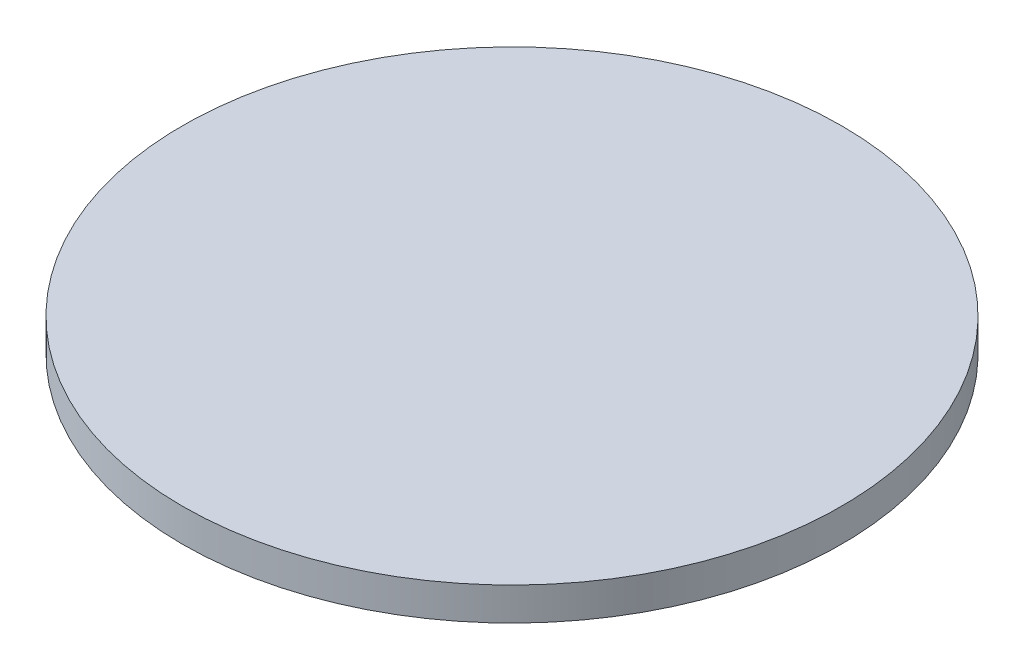
ISO-10303-21;
HEADER;
FILE_DESCRIPTION(('STEP AP214'),'2;1');
FILE_NAME('part.step','',(''),(''),'','','');
FILE_SCHEMA(('AUTOMOTIVE_DESIGN { 1 0 10303 214 1 1 1 1 }'));
ENDSEC;
DATA;
#1=APPLICATION_CONTEXT('core data for automotive mechanical design processes');
#2=APPLICATION_PROTOCOL_DEFINITION('international standard','automotive_design',2000,#1);
#3=PRODUCT_CONTEXT('',#1,'mechanical');
#4=PRODUCT('Part','Part','',(#3));
#5=PRODUCT_RELATED_PRODUCT_CATEGORY('part','',(#4));
#6=PRODUCT_DEFINITION_FORMATION('','',#4);
#7=PRODUCT_DEFINITION_CONTEXT('part definition',#1,'design');
#8=PRODUCT_DEFINITION('design','',#6,#7);
#9=PRODUCT_DEFINITION_SHAPE('','',#8);
#10=(LENGTH_UNIT() NAMED_UNIT(*) SI_UNIT(.MILLI.,.METRE.));
#11=(NAMED_UNIT(*) PLANE_ANGLE_UNIT() SI_UNIT($,.RADIAN.));
#12=(NAMED_UNIT(*) SI_UNIT($,.STERADIAN.) SOLID_ANGLE_UNIT());
#13=UNCERTAINTY_MEASURE_WITH_UNIT(LENGTH_MEASURE(1.E-05),#10,'distance_accuracy_value','');
#14=(GEOMETRIC_REPRESENTATION_CONTEXT(3) GLOBAL_UNCERTAINTY_ASSIGNED_CONTEXT((#13)) GLOBAL_UNIT_ASSIGNED_CONTEXT((#10,
#11,#12)) REPRESENTATION_CONTEXT('',''));
#15=CARTESIAN_POINT('',(0.,0.,0.));
#16=DIRECTION('',(0.,0.,1.));
#17=DIRECTION('',(1.,0.,0.));
#18=AXIS2_PLACEMENT_3D('',#15,#16,#17);
#19=CARTESIAN_POINT('',(-5.77965032751804,6.,0.));
#20=DIRECTION('',(0.,-1.,0.));
#21=DIRECTION('',(0.,0.,-1.));
#22=AXIS2_PLACEMENT_3D('',#19,#20,#21);
#23=CYLINDRICAL_SURFACE('',#22,25.);
#24=CARTESIAN_POINT('',(-5.77965032751804,3.50000000000001,0.));
#25=DIRECTION('',(0.,1.,0.));
#26=DIRECTION('',(0.,0.,1.));
#27=AXIS2_PLACEMENT_3D('',#24,#25,#26);
#28=CIRCLE('',#27,25.);
#29=CARTESIAN_POINT('',(-5.77965032751804,3.50000000000001,25.));
#30=VERTEX_POINT('',#29);
#31=EDGE_CURVE('E37',#30,#30,#28,.T.);
#32=ORIENTED_EDGE('',*,*,#31,.T.);
#33=EDGE_LOOP('',(#32));
#34=FACE_BOUND('',#33,.T.);
#35=CARTESIAN_POINT('',(-5.77965032751804,6.,0.));
#36=DIRECTION('',(0.,1.,0.));
#37=DIRECTION('',(0.,0.,1.));
#38=AXIS2_PLACEMENT_3D('',#35,#36,#37);
#39=CIRCLE('',#38,25.);
#40=CARTESIAN_POINT('',(-5.77965032751804,6.,25.));
#41=VERTEX_POINT('',#40);
#42=EDGE_CURVE('E41',#41,#41,#39,.T.);
#43=ORIENTED_EDGE('',*,*,#42,.F.);
#44=EDGE_LOOP('',(#43));
#45=FACE_BOUND('',#44,.T.);
#46=ADVANCED_FACE('F30',(#34,#45),#23,.T.);
#47=CARTESIAN_POINT('',(-5.77965032751804,6.,0.));
#48=DIRECTION('',(0.,1.,0.));
#49=DIRECTION('',(0.,0.,1.));
#50=AXIS2_PLACEMENT_3D('',#47,#48,#49);
#51=PLANE('',#50);
#52=ORIENTED_EDGE('',*,*,#42,.T.);
#53=EDGE_LOOP('',(#52));
#54=FACE_BOUND('',#53,.T.);
#55=ADVANCED_FACE('F48',(#54),#51,.T.);
#56=CARTESIAN_POINT('',(-5.77965032751804,0.,0.));
#57=DIRECTION('',(0.,1.,0.));
#58=DIRECTION('',(0.,0.,1.));
#59=AXIS2_PLACEMENT_3D('',#56,#57,#58);
#60=PLANE('',#59);
#61=CARTESIAN_POINT('',(-5.77965032751804,0.,0.));
#62=DIRECTION('',(0.,1.,0.));
#63=DIRECTION('',(0.,0.,1.));
#64=AXIS2_PLACEMENT_3D('',#61,#62,#63);
#65=CIRCLE('',#64,19.);
#66=CARTESIAN_POINT('',(-5.77965032751804,0.,19.));
#67=VERTEX_POINT('',#66);
#68=EDGE_CURVE('E10',#67,#67,#65,.F.);
#69=ORIENTED_EDGE('',*,*,#68,.T.);
#70=EDGE_LOOP('',(#69));
#71=FACE_BOUND('',#70,.T.);
#72=ADVANCED_FACE('F54',(#71),#60,.F.);
#73=CARTESIAN_POINT('',(-5.77965032751804,3.50000000000001,0.));
#74=DIRECTION('',(0.,1.,0.));
#75=DIRECTION('',(0.,0.,1.));
#76=AXIS2_PLACEMENT_3D('',#73,#74,#75);
#77=CONICAL_SURFACE('',#76,25.,1.04272187836854);
#78=ORIENTED_EDGE('',*,*,#68,.F.);
#79=EDGE_LOOP('',(#78));
#80=FACE_BOUND('',#79,.T.);
#81=ORIENTED_EDGE('',*,*,#31,.F.);
#82=EDGE_LOOP('',(#81));
#83=FACE_BOUND('',#82,.T.);
#84=ADVANCED_FACE('F32',(#80,#83),#77,.T.);
#85=CLOSED_SHELL('',(#46,#55,#72,#84));
#86=MANIFOLD_SOLID_BREP('B2',#85);
#87=ADVANCED_BREP_SHAPE_REPRESENTATION('',(#18,#86),#14);
#88=SHAPE_DEFINITION_REPRESENTATION(#9,#87);
ENDSEC;
END-ISO-10303-21;
